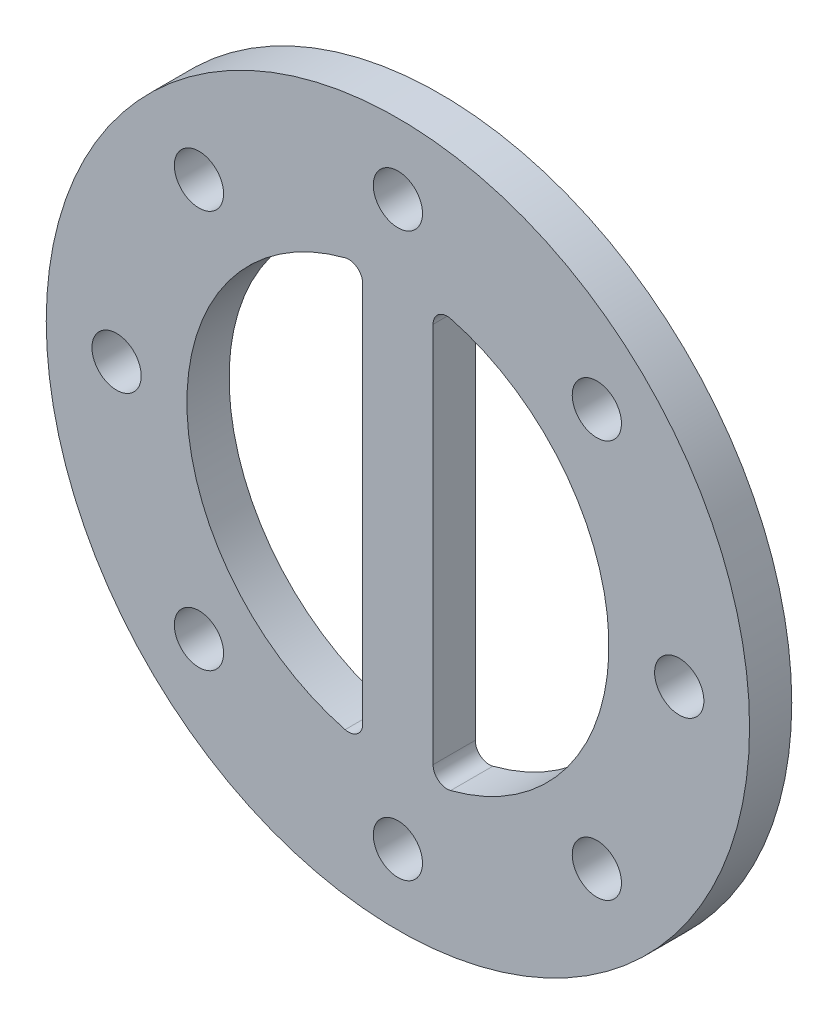
ISO-10303-21;
HEADER;
FILE_DESCRIPTION(('STEP AP214'),'2;1');
FILE_NAME('part.step','',(''),(''),'','','');
FILE_SCHEMA(('AUTOMOTIVE_DESIGN { 1 0 10303 214 1 1 1 1 }'));
ENDSEC;
DATA;
#1=APPLICATION_CONTEXT('core data for automotive mechanical design processes');
#2=APPLICATION_PROTOCOL_DEFINITION('international standard','automotive_design',2000,#1);
#3=PRODUCT_CONTEXT('',#1,'mechanical');
#4=PRODUCT('Part','Part','',(#3));
#5=PRODUCT_RELATED_PRODUCT_CATEGORY('part','',(#4));
#6=PRODUCT_DEFINITION_FORMATION('','',#4);
#7=PRODUCT_DEFINITION_CONTEXT('part definition',#1,'design');
#8=PRODUCT_DEFINITION('design','',#6,#7);
#9=PRODUCT_DEFINITION_SHAPE('','',#8);
#10=(LENGTH_UNIT() NAMED_UNIT(*) SI_UNIT(.MILLI.,.METRE.));
#11=(NAMED_UNIT(*) PLANE_ANGLE_UNIT() SI_UNIT($,.RADIAN.));
#12=(NAMED_UNIT(*) SI_UNIT($,.STERADIAN.) SOLID_ANGLE_UNIT());
#13=UNCERTAINTY_MEASURE_WITH_UNIT(LENGTH_MEASURE(1.E-05),#10,'distance_accuracy_value','');
#14=(GEOMETRIC_REPRESENTATION_CONTEXT(3) GLOBAL_UNCERTAINTY_ASSIGNED_CONTEXT((#13)) GLOBAL_UNIT_ASSIGNED_CONTEXT((#10,
#11,#12)) REPRESENTATION_CONTEXT('',''));
#15=CARTESIAN_POINT('',(0.,0.,0.));
#16=DIRECTION('',(0.,0.,1.));
#17=DIRECTION('',(1.,0.,0.));
#18=AXIS2_PLACEMENT_3D('',#15,#16,#17);
#19=CARTESIAN_POINT('',(0.,0.,3.));
#20=DIRECTION('',(0.,0.,-1.));
#21=DIRECTION('',(-1.,0.,0.));
#22=AXIS2_PLACEMENT_3D('',#19,#20,#21);
#23=CYLINDRICAL_SURFACE('',#22,25.);
#24=CARTESIAN_POINT('',(0.,0.,3.));
#25=DIRECTION('',(0.,0.,1.));
#26=DIRECTION('',(1.,0.,0.));
#27=AXIS2_PLACEMENT_3D('',#24,#25,#26);
#28=CIRCLE('',#27,25.);
#29=CARTESIAN_POINT('',(25.,0.,3.));
#30=VERTEX_POINT('',#29);
#31=EDGE_CURVE('E182',#30,#30,#28,.T.);
#32=ORIENTED_EDGE('',*,*,#31,.F.);
#33=EDGE_LOOP('',(#32));
#34=FACE_BOUND('',#33,.T.);
#35=CARTESIAN_POINT('',(0.,0.,0.));
#36=DIRECTION('',(0.,0.,1.));
#37=DIRECTION('',(1.,0.,0.));
#38=AXIS2_PLACEMENT_3D('',#35,#36,#37);
#39=CIRCLE('',#38,25.);
#40=CARTESIAN_POINT('',(25.,0.,0.));
#41=VERTEX_POINT('',#40);
#42=EDGE_CURVE('E179',#41,#41,#39,.T.);
#43=ORIENTED_EDGE('',*,*,#42,.T.);
#44=EDGE_LOOP('',(#43));
#45=FACE_BOUND('',#44,.T.);
#46=ADVANCED_FACE('F33',(#34,#45),#23,.T.);
#47=CARTESIAN_POINT('',(0.,0.,3.));
#48=DIRECTION('',(0.,0.,1.));
#49=DIRECTION('',(1.,0.,0.));
#50=AXIS2_PLACEMENT_3D('',#47,#48,#49);
#51=PLANE('',#50);
#52=CARTESIAN_POINT('',(0.,0.,3.));
#53=DIRECTION('',(0.,0.,1.));
#54=DIRECTION('',(1.,0.,0.));
#55=AXIS2_PLACEMENT_3D('',#52,#53,#54);
#56=CIRCLE('',#55,15.);
#57=CARTESIAN_POINT('',(3.75,-14.5236875482778,3.));
#58=VERTEX_POINT('',#57);
#59=CARTESIAN_POINT('',(3.75,14.5236875482778,3.));
#60=VERTEX_POINT('',#59);
#61=EDGE_CURVE('E115',#58,#60,#56,.T.);
#62=ORIENTED_EDGE('',*,*,#61,.F.);
#63=CARTESIAN_POINT('',(3.5,-13.555441711726,3.));
#64=DIRECTION('',(0.,0.,1.));
#65=DIRECTION('',(1.,0.,0.));
#66=AXIS2_PLACEMENT_3D('',#63,#64,#65);
#67=CIRCLE('',#66,1.);
#68=CARTESIAN_POINT('',(2.5,-13.555441711726,3.));
#69=VERTEX_POINT('',#68);
#70=EDGE_CURVE('E99',#58,#69,#67,.F.);
#71=ORIENTED_EDGE('',*,*,#70,.T.);
#72=DIRECTION('',(0.,-1.,0.));
#73=VECTOR('',#72,1.);
#74=CARTESIAN_POINT('',(2.5,14.790199457749,3.));
#75=LINE('',#74,#73);
#76=CARTESIAN_POINT('',(2.5,13.555441711726,3.));
#77=VERTEX_POINT('',#76);
#78=EDGE_CURVE('E124',#77,#69,#75,.T.);
#79=ORIENTED_EDGE('',*,*,#78,.F.);
#80=CARTESIAN_POINT('',(3.5,13.555441711726,3.));
#81=DIRECTION('',(0.,0.,1.));
#82=DIRECTION('',(1.,0.,0.));
#83=AXIS2_PLACEMENT_3D('',#80,#81,#82);
#84=CIRCLE('',#83,1.);
#85=EDGE_CURVE('E41',#77,#60,#84,.F.);
#86=ORIENTED_EDGE('',*,*,#85,.T.);
#87=EDGE_LOOP('',(#62,#71,#79,#86));
#88=FACE_BOUND('',#87,.T.);
#89=CARTESIAN_POINT('',(0.,0.,3.));
#90=DIRECTION('',(0.,0.,1.));
#91=DIRECTION('',(1.,0.,0.));
#92=AXIS2_PLACEMENT_3D('',#89,#90,#91);
#93=CIRCLE('',#92,15.);
#94=CARTESIAN_POINT('',(-3.75,14.5236875482778,3.));
#95=VERTEX_POINT('',#94);
#96=CARTESIAN_POINT('',(-3.75,-14.5236875482778,3.));
#97=VERTEX_POINT('',#96);
#98=EDGE_CURVE('E126',#95,#97,#93,.T.);
#99=ORIENTED_EDGE('',*,*,#98,.F.);
#100=CARTESIAN_POINT('',(-3.5,13.555441711726,3.));
#101=DIRECTION('',(0.,0.,1.));
#102=DIRECTION('',(1.,0.,0.));
#103=AXIS2_PLACEMENT_3D('',#100,#101,#102);
#104=CIRCLE('',#103,1.);
#105=CARTESIAN_POINT('',(-2.5,13.555441711726,3.));
#106=VERTEX_POINT('',#105);
#107=EDGE_CURVE('E213',#95,#106,#104,.F.);
#108=ORIENTED_EDGE('',*,*,#107,.T.);
#109=DIRECTION('',(0.,1.,0.));
#110=VECTOR('',#109,1.);
#111=CARTESIAN_POINT('',(-2.5,14.790199457749,3.));
#112=LINE('',#111,#110);
#113=CARTESIAN_POINT('',(-2.5,-13.555441711726,3.));
#114=VERTEX_POINT('',#113);
#115=EDGE_CURVE('E130',#114,#106,#112,.T.);
#116=ORIENTED_EDGE('',*,*,#115,.F.);
#117=CARTESIAN_POINT('',(-3.5,-13.555441711726,3.));
#118=DIRECTION('',(0.,0.,1.));
#119=DIRECTION('',(1.,0.,0.));
#120=AXIS2_PLACEMENT_3D('',#117,#118,#119);
#121=CIRCLE('',#120,1.);
#122=EDGE_CURVE('E209',#114,#97,#121,.F.);
#123=ORIENTED_EDGE('',*,*,#122,.T.);
#124=EDGE_LOOP('',(#99,#108,#116,#123));
#125=FACE_BOUND('',#124,.T.);
#126=CARTESIAN_POINT('',(14.1421356237308,14.1421356237311,3.));
#127=DIRECTION('',(0.,0.,1.));
#128=DIRECTION('',(0.707106781186556,-0.707106781186539,0.));
#129=AXIS2_PLACEMENT_3D('',#126,#127,#128);
#130=CIRCLE('',#129,1.75);
#131=CARTESIAN_POINT('',(15.3795724908073,12.9046987566547,3.));
#132=VERTEX_POINT('',#131);
#133=EDGE_CURVE('E133',#132,#132,#130,.T.);
#134=ORIENTED_EDGE('',*,*,#133,.F.);
#135=EDGE_LOOP('',(#134));
#136=FACE_BOUND('',#135,.T.);
#137=CARTESIAN_POINT('',(20.,2.09418175640307E-13,3.));
#138=DIRECTION('',(0.,0.,1.));
#139=DIRECTION('',(0.,-1.,0.));
#140=AXIS2_PLACEMENT_3D('',#137,#138,#139);
#141=CIRCLE('',#140,1.75);
#142=CARTESIAN_POINT('',(20.,-1.74999999999979,3.));
#143=VERTEX_POINT('',#142);
#144=EDGE_CURVE('E137',#143,#143,#141,.T.);
#145=ORIENTED_EDGE('',*,*,#144,.F.);
#146=EDGE_LOOP('',(#145));
#147=FACE_BOUND('',#146,.T.);
#148=CARTESIAN_POINT('',(14.1421356237311,-14.1421356237308,3.));
#149=DIRECTION('',(0.,0.,1.));
#150=DIRECTION('',(-0.707106781186541,-0.707106781186554,0.));
#151=AXIS2_PLACEMENT_3D('',#148,#149,#150);
#152=CIRCLE('',#151,1.75);
#153=CARTESIAN_POINT('',(12.9046987566546,-15.3795724908073,3.));
#154=VERTEX_POINT('',#153);
#155=EDGE_CURVE('E143',#154,#154,#152,.T.);
#156=ORIENTED_EDGE('',*,*,#155,.F.);
#157=EDGE_LOOP('',(#156));
#158=FACE_BOUND('',#157,.T.);
#159=CARTESIAN_POINT('',(0.,-20.,3.));
#160=DIRECTION('',(0.,0.,1.));
#161=DIRECTION('',(-1.,0.,0.));
#162=AXIS2_PLACEMENT_3D('',#159,#160,#161);
#163=CIRCLE('',#162,1.75);
#164=CARTESIAN_POINT('',(-1.75,-20.,3.));
#165=VERTEX_POINT('',#164);
#166=EDGE_CURVE('E149',#165,#165,#163,.T.);
#167=ORIENTED_EDGE('',*,*,#166,.F.);
#168=EDGE_LOOP('',(#167));
#169=FACE_BOUND('',#168,.T.);
#170=CARTESIAN_POINT('',(-14.1421356237309,-14.142135623731,3.));
#171=DIRECTION('',(0.,0.,1.));
#172=DIRECTION('',(-0.707106781186551,0.707106781186544,0.));
#173=AXIS2_PLACEMENT_3D('',#170,#171,#172);
#174=CIRCLE('',#173,1.75);
#175=CARTESIAN_POINT('',(-15.3795724908073,-12.9046987566546,3.));
#176=VERTEX_POINT('',#175);
#177=EDGE_CURVE('E155',#176,#176,#174,.T.);
#178=ORIENTED_EDGE('',*,*,#177,.F.);
#179=EDGE_LOOP('',(#178));
#180=FACE_BOUND('',#179,.T.);
#181=CARTESIAN_POINT('',(-20.,0.,3.));
#182=DIRECTION('',(0.,0.,1.));
#183=DIRECTION('',(0.,1.,0.));
#184=AXIS2_PLACEMENT_3D('',#181,#182,#183);
#185=CIRCLE('',#184,1.75);
#186=CARTESIAN_POINT('',(-20.,1.74999999999993,3.));
#187=VERTEX_POINT('',#186);
#188=EDGE_CURVE('E161',#187,#187,#185,.T.);
#189=ORIENTED_EDGE('',*,*,#188,.F.);
#190=EDGE_LOOP('',(#189));
#191=FACE_BOUND('',#190,.T.);
#192=CARTESIAN_POINT('',(-14.142135623731,14.1421356237309,3.));
#193=DIRECTION('',(0.,0.,1.));
#194=DIRECTION('',(0.707106781186546,0.707106781186549,0.));
#195=AXIS2_PLACEMENT_3D('',#192,#193,#194);
#196=CIRCLE('',#195,1.75);
#197=CARTESIAN_POINT('',(-12.9046987566545,15.3795724908074,3.));
#198=VERTEX_POINT('',#197);
#199=EDGE_CURVE('E167',#198,#198,#196,.T.);
#200=ORIENTED_EDGE('',*,*,#199,.F.);
#201=EDGE_LOOP('',(#200));
#202=FACE_BOUND('',#201,.T.);
#203=CARTESIAN_POINT('',(0.,20.,3.));
#204=DIRECTION('',(0.,0.,1.));
#205=DIRECTION('',(1.,0.,0.));
#206=AXIS2_PLACEMENT_3D('',#203,#204,#205);
#207=CIRCLE('',#206,1.75);
#208=CARTESIAN_POINT('',(1.75,20.,3.));
#209=VERTEX_POINT('',#208);
#210=EDGE_CURVE('E173',#209,#209,#207,.T.);
#211=ORIENTED_EDGE('',*,*,#210,.F.);
#212=EDGE_LOOP('',(#211));
#213=FACE_BOUND('',#212,.T.);
#214=ORIENTED_EDGE('',*,*,#31,.T.);
#215=EDGE_LOOP('',(#214));
#216=FACE_BOUND('',#215,.T.);
#217=ADVANCED_FACE('F122',(#88,#125,#136,#147,#158,#169,#180,#191,#202,#213,#216),#51,.T.);
#218=CARTESIAN_POINT('',(0.,0.,0.));
#219=DIRECTION('',(0.,0.,1.));
#220=DIRECTION('',(1.,0.,0.));
#221=AXIS2_PLACEMENT_3D('',#218,#219,#220);
#222=PLANE('',#221);
#223=CARTESIAN_POINT('',(0.,0.,0.));
#224=DIRECTION('',(0.,0.,1.));
#225=DIRECTION('',(1.,0.,0.));
#226=AXIS2_PLACEMENT_3D('',#223,#224,#225);
#227=CIRCLE('',#226,15.);
#228=CARTESIAN_POINT('',(3.75,-14.5236875482778,0.));
#229=VERTEX_POINT('',#228);
#230=CARTESIAN_POINT('',(3.75,14.5236875482778,0.));
#231=VERTEX_POINT('',#230);
#232=EDGE_CURVE('E118',#229,#231,#227,.T.);
#233=ORIENTED_EDGE('',*,*,#232,.T.);
#234=CARTESIAN_POINT('',(3.5,13.555441711726,0.));
#235=DIRECTION('',(0.,0.,1.));
#236=DIRECTION('',(1.,0.,0.));
#237=AXIS2_PLACEMENT_3D('',#234,#235,#236);
#238=CIRCLE('',#237,1.);
#239=CARTESIAN_POINT('',(2.5,13.555441711726,0.));
#240=VERTEX_POINT('',#239);
#241=EDGE_CURVE('E11',#231,#240,#238,.T.);
#242=ORIENTED_EDGE('',*,*,#241,.T.);
#243=DIRECTION('',(0.,-1.,0.));
#244=VECTOR('',#243,1.);
#245=CARTESIAN_POINT('',(2.5,0.,0.));
#246=LINE('',#245,#244);
#247=CARTESIAN_POINT('',(2.5,-13.555441711726,0.));
#248=VERTEX_POINT('',#247);
#249=EDGE_CURVE('E191',#240,#248,#246,.T.);
#250=ORIENTED_EDGE('',*,*,#249,.T.);
#251=CARTESIAN_POINT('',(3.5,-13.555441711726,0.));
#252=DIRECTION('',(0.,0.,1.));
#253=DIRECTION('',(1.,0.,0.));
#254=AXIS2_PLACEMENT_3D('',#251,#252,#253);
#255=CIRCLE('',#254,1.);
#256=EDGE_CURVE('E109',#248,#229,#255,.T.);
#257=ORIENTED_EDGE('',*,*,#256,.T.);
#258=EDGE_LOOP('',(#233,#242,#250,#257));
#259=FACE_BOUND('',#258,.T.);
#260=CARTESIAN_POINT('',(0.,0.,0.));
#261=DIRECTION('',(0.,0.,1.));
#262=DIRECTION('',(1.,0.,0.));
#263=AXIS2_PLACEMENT_3D('',#260,#261,#262);
#264=CIRCLE('',#263,15.);
#265=CARTESIAN_POINT('',(-3.75,14.5236875482778,0.));
#266=VERTEX_POINT('',#265);
#267=CARTESIAN_POINT('',(-3.75,-14.5236875482778,0.));
#268=VERTEX_POINT('',#267);
#269=EDGE_CURVE('E189',#266,#268,#264,.T.);
#270=ORIENTED_EDGE('',*,*,#269,.T.);
#271=CARTESIAN_POINT('',(-3.5,-13.555441711726,0.));
#272=DIRECTION('',(0.,0.,1.));
#273=DIRECTION('',(1.,0.,0.));
#274=AXIS2_PLACEMENT_3D('',#271,#272,#273);
#275=CIRCLE('',#274,1.);
#276=CARTESIAN_POINT('',(-2.5,-13.555441711726,0.));
#277=VERTEX_POINT('',#276);
#278=EDGE_CURVE('E211',#268,#277,#275,.T.);
#279=ORIENTED_EDGE('',*,*,#278,.T.);
#280=DIRECTION('',(0.,1.,0.));
#281=VECTOR('',#280,1.);
#282=CARTESIAN_POINT('',(-2.5,0.,0.));
#283=LINE('',#282,#281);
#284=CARTESIAN_POINT('',(-2.5,13.555441711726,0.));
#285=VERTEX_POINT('',#284);
#286=EDGE_CURVE('E185',#277,#285,#283,.T.);
#287=ORIENTED_EDGE('',*,*,#286,.T.);
#288=CARTESIAN_POINT('',(-3.5,13.555441711726,0.));
#289=DIRECTION('',(0.,0.,1.));
#290=DIRECTION('',(1.,0.,0.));
#291=AXIS2_PLACEMENT_3D('',#288,#289,#290);
#292=CIRCLE('',#291,1.);
#293=EDGE_CURVE('E55',#285,#266,#292,.T.);
#294=ORIENTED_EDGE('',*,*,#293,.T.);
#295=EDGE_LOOP('',(#270,#279,#287,#294));
#296=FACE_BOUND('',#295,.T.);
#297=CARTESIAN_POINT('',(14.1421356237308,14.1421356237311,0.));
#298=DIRECTION('',(0.,0.,1.));
#299=DIRECTION('',(0.707106781186556,-0.707106781186539,0.));
#300=AXIS2_PLACEMENT_3D('',#297,#298,#299);
#301=CIRCLE('',#300,1.75);
#302=CARTESIAN_POINT('',(15.3795724908073,12.9046987566547,0.));
#303=VERTEX_POINT('',#302);
#304=EDGE_CURVE('E134',#303,#303,#301,.T.);
#305=ORIENTED_EDGE('',*,*,#304,.T.);
#306=EDGE_LOOP('',(#305));
#307=FACE_BOUND('',#306,.T.);
#308=CARTESIAN_POINT('',(20.,2.09418175640307E-13,0.));
#309=DIRECTION('',(0.,0.,1.));
#310=DIRECTION('',(0.,-1.,0.));
#311=AXIS2_PLACEMENT_3D('',#308,#309,#310);
#312=CIRCLE('',#311,1.75);
#313=CARTESIAN_POINT('',(20.,-1.74999999999979,0.));
#314=VERTEX_POINT('',#313);
#315=EDGE_CURVE('E140',#314,#314,#312,.T.);
#316=ORIENTED_EDGE('',*,*,#315,.T.);
#317=EDGE_LOOP('',(#316));
#318=FACE_BOUND('',#317,.T.);
#319=CARTESIAN_POINT('',(14.1421356237311,-14.1421356237308,0.));
#320=DIRECTION('',(0.,0.,1.));
#321=DIRECTION('',(-0.707106781186541,-0.707106781186554,0.));
#322=AXIS2_PLACEMENT_3D('',#319,#320,#321);
#323=CIRCLE('',#322,1.75);
#324=CARTESIAN_POINT('',(12.9046987566546,-15.3795724908073,0.));
#325=VERTEX_POINT('',#324);
#326=EDGE_CURVE('E146',#325,#325,#323,.T.);
#327=ORIENTED_EDGE('',*,*,#326,.T.);
#328=EDGE_LOOP('',(#327));
#329=FACE_BOUND('',#328,.T.);
#330=CARTESIAN_POINT('',(0.,-20.,0.));
#331=DIRECTION('',(0.,0.,1.));
#332=DIRECTION('',(-1.,0.,0.));
#333=AXIS2_PLACEMENT_3D('',#330,#331,#332);
#334=CIRCLE('',#333,1.75);
#335=CARTESIAN_POINT('',(-1.75,-20.,0.));
#336=VERTEX_POINT('',#335);
#337=EDGE_CURVE('E152',#336,#336,#334,.T.);
#338=ORIENTED_EDGE('',*,*,#337,.T.);
#339=EDGE_LOOP('',(#338));
#340=FACE_BOUND('',#339,.T.);
#341=CARTESIAN_POINT('',(-14.1421356237309,-14.142135623731,0.));
#342=DIRECTION('',(0.,0.,1.));
#343=DIRECTION('',(-0.707106781186551,0.707106781186544,0.));
#344=AXIS2_PLACEMENT_3D('',#341,#342,#343);
#345=CIRCLE('',#344,1.75);
#346=CARTESIAN_POINT('',(-15.3795724908073,-12.9046987566546,0.));
#347=VERTEX_POINT('',#346);
#348=EDGE_CURVE('E158',#347,#347,#345,.T.);
#349=ORIENTED_EDGE('',*,*,#348,.T.);
#350=EDGE_LOOP('',(#349));
#351=FACE_BOUND('',#350,.T.);
#352=CARTESIAN_POINT('',(-20.,0.,0.));
#353=DIRECTION('',(0.,0.,1.));
#354=DIRECTION('',(0.,1.,0.));
#355=AXIS2_PLACEMENT_3D('',#352,#353,#354);
#356=CIRCLE('',#355,1.75);
#357=CARTESIAN_POINT('',(-20.,1.74999999999993,0.));
#358=VERTEX_POINT('',#357);
#359=EDGE_CURVE('E164',#358,#358,#356,.T.);
#360=ORIENTED_EDGE('',*,*,#359,.T.);
#361=EDGE_LOOP('',(#360));
#362=FACE_BOUND('',#361,.T.);
#363=CARTESIAN_POINT('',(-14.142135623731,14.1421356237309,0.));
#364=DIRECTION('',(0.,0.,1.));
#365=DIRECTION('',(0.707106781186546,0.707106781186549,0.));
#366=AXIS2_PLACEMENT_3D('',#363,#364,#365);
#367=CIRCLE('',#366,1.75);
#368=CARTESIAN_POINT('',(-12.9046987566545,15.3795724908074,0.));
#369=VERTEX_POINT('',#368);
#370=EDGE_CURVE('E170',#369,#369,#367,.T.);
#371=ORIENTED_EDGE('',*,*,#370,.T.);
#372=EDGE_LOOP('',(#371));
#373=FACE_BOUND('',#372,.T.);
#374=CARTESIAN_POINT('',(0.,20.,0.));
#375=DIRECTION('',(0.,0.,1.));
#376=DIRECTION('',(1.,0.,0.));
#377=AXIS2_PLACEMENT_3D('',#374,#375,#376);
#378=CIRCLE('',#377,1.75);
#379=CARTESIAN_POINT('',(1.75,20.,0.));
#380=VERTEX_POINT('',#379);
#381=EDGE_CURVE('E176',#380,#380,#378,.T.);
#382=ORIENTED_EDGE('',*,*,#381,.T.);
#383=EDGE_LOOP('',(#382));
#384=FACE_BOUND('',#383,.T.);
#385=ORIENTED_EDGE('',*,*,#42,.F.);
#386=EDGE_LOOP('',(#385));
#387=FACE_BOUND('',#386,.T.);
#388=ADVANCED_FACE('F228',(#259,#296,#307,#318,#329,#340,#351,#362,#373,#384,#387),#222,.F.);
#389=CARTESIAN_POINT('',(0.,20.,0.));
#390=DIRECTION('',(0.,0.,1.));
#391=DIRECTION('',(1.,0.,0.));
#392=AXIS2_PLACEMENT_3D('',#389,#390,#391);
#393=CYLINDRICAL_SURFACE('',#392,1.75);
#394=ORIENTED_EDGE('',*,*,#381,.F.);
#395=EDGE_LOOP('',(#394));
#396=FACE_BOUND('',#395,.T.);
#397=ORIENTED_EDGE('',*,*,#210,.T.);
#398=EDGE_LOOP('',(#397));
#399=FACE_BOUND('',#398,.T.);
#400=ADVANCED_FACE('F251',(#396,#399),#393,.F.);
#401=CARTESIAN_POINT('',(-14.142135623731,14.1421356237309,0.));
#402=DIRECTION('',(0.,0.,1.));
#403=DIRECTION('',(1.,0.,0.));
#404=AXIS2_PLACEMENT_3D('',#401,#402,#403);
#405=CYLINDRICAL_SURFACE('',#404,1.75);
#406=ORIENTED_EDGE('',*,*,#370,.F.);
#407=EDGE_LOOP('',(#406));
#408=FACE_BOUND('',#407,.T.);
#409=ORIENTED_EDGE('',*,*,#199,.T.);
#410=EDGE_LOOP('',(#409));
#411=FACE_BOUND('',#410,.T.);
#412=ADVANCED_FACE('F256',(#408,#411),#405,.F.);
#413=CARTESIAN_POINT('',(-20.,0.,0.));
#414=DIRECTION('',(0.,0.,1.));
#415=DIRECTION('',(1.,0.,0.));
#416=AXIS2_PLACEMENT_3D('',#413,#414,#415);
#417=CYLINDRICAL_SURFACE('',#416,1.75);
#418=ORIENTED_EDGE('',*,*,#359,.F.);
#419=EDGE_LOOP('',(#418));
#420=FACE_BOUND('',#419,.T.);
#421=ORIENTED_EDGE('',*,*,#188,.T.);
#422=EDGE_LOOP('',(#421));
#423=FACE_BOUND('',#422,.T.);
#424=ADVANCED_FACE('F260',(#420,#423),#417,.F.);
#425=CARTESIAN_POINT('',(-14.1421356237309,-14.142135623731,0.));
#426=DIRECTION('',(0.,0.,1.));
#427=DIRECTION('',(1.,0.,0.));
#428=AXIS2_PLACEMENT_3D('',#425,#426,#427);
#429=CYLINDRICAL_SURFACE('',#428,1.75);
#430=ORIENTED_EDGE('',*,*,#348,.F.);
#431=EDGE_LOOP('',(#430));
#432=FACE_BOUND('',#431,.T.);
#433=ORIENTED_EDGE('',*,*,#177,.T.);
#434=EDGE_LOOP('',(#433));
#435=FACE_BOUND('',#434,.T.);
#436=ADVANCED_FACE('F264',(#432,#435),#429,.F.);
#437=CARTESIAN_POINT('',(0.,-20.,0.));
#438=DIRECTION('',(0.,0.,1.));
#439=DIRECTION('',(1.,0.,0.));
#440=AXIS2_PLACEMENT_3D('',#437,#438,#439);
#441=CYLINDRICAL_SURFACE('',#440,1.75);
#442=ORIENTED_EDGE('',*,*,#337,.F.);
#443=EDGE_LOOP('',(#442));
#444=FACE_BOUND('',#443,.T.);
#445=ORIENTED_EDGE('',*,*,#166,.T.);
#446=EDGE_LOOP('',(#445));
#447=FACE_BOUND('',#446,.T.);
#448=ADVANCED_FACE('F268',(#444,#447),#441,.F.);
#449=CARTESIAN_POINT('',(14.1421356237311,-14.1421356237308,0.));
#450=DIRECTION('',(0.,0.,1.));
#451=DIRECTION('',(1.,0.,0.));
#452=AXIS2_PLACEMENT_3D('',#449,#450,#451);
#453=CYLINDRICAL_SURFACE('',#452,1.75);
#454=ORIENTED_EDGE('',*,*,#326,.F.);
#455=EDGE_LOOP('',(#454));
#456=FACE_BOUND('',#455,.T.);
#457=ORIENTED_EDGE('',*,*,#155,.T.);
#458=EDGE_LOOP('',(#457));
#459=FACE_BOUND('',#458,.T.);
#460=ADVANCED_FACE('F272',(#456,#459),#453,.F.);
#461=CARTESIAN_POINT('',(20.,2.09418175640307E-13,0.));
#462=DIRECTION('',(0.,0.,1.));
#463=DIRECTION('',(1.,0.,0.));
#464=AXIS2_PLACEMENT_3D('',#461,#462,#463);
#465=CYLINDRICAL_SURFACE('',#464,1.75);
#466=ORIENTED_EDGE('',*,*,#315,.F.);
#467=EDGE_LOOP('',(#466));
#468=FACE_BOUND('',#467,.T.);
#469=ORIENTED_EDGE('',*,*,#144,.T.);
#470=EDGE_LOOP('',(#469));
#471=FACE_BOUND('',#470,.T.);
#472=ADVANCED_FACE('F276',(#468,#471),#465,.F.);
#473=CARTESIAN_POINT('',(14.1421356237308,14.1421356237311,0.));
#474=DIRECTION('',(0.,0.,1.));
#475=DIRECTION('',(1.,0.,0.));
#476=AXIS2_PLACEMENT_3D('',#473,#474,#475);
#477=CYLINDRICAL_SURFACE('',#476,1.75);
#478=ORIENTED_EDGE('',*,*,#304,.F.);
#479=EDGE_LOOP('',(#478));
#480=FACE_BOUND('',#479,.T.);
#481=ORIENTED_EDGE('',*,*,#133,.T.);
#482=EDGE_LOOP('',(#481));
#483=FACE_BOUND('',#482,.T.);
#484=ADVANCED_FACE('F280',(#480,#483),#477,.F.);
#485=CARTESIAN_POINT('',(0.,0.,-7.));
#486=DIRECTION('',(0.,0.,1.));
#487=DIRECTION('',(1.,0.,0.));
#488=AXIS2_PLACEMENT_3D('',#485,#486,#487);
#489=CYLINDRICAL_SURFACE('',#488,15.);
#490=ORIENTED_EDGE('',*,*,#98,.T.);
#491=DIRECTION('',(0.,0.,1.));
#492=VECTOR('',#491,1.);
#493=CARTESIAN_POINT('',(-3.75,-14.5236875482778,-7.));
#494=LINE('',#493,#492);
#495=EDGE_CURVE('E48',#97,#268,#494,.F.);
#496=ORIENTED_EDGE('',*,*,#495,.T.);
#497=ORIENTED_EDGE('',*,*,#269,.F.);
#498=DIRECTION('',(0.,0.,1.));
#499=VECTOR('',#498,1.);
#500=CARTESIAN_POINT('',(-3.75,14.5236875482778,-7.));
#501=LINE('',#500,#499);
#502=EDGE_CURVE('E204',#266,#95,#501,.T.);
#503=ORIENTED_EDGE('',*,*,#502,.T.);
#504=EDGE_LOOP('',(#490,#496,#497,#503));
#505=FACE_BOUND('',#504,.T.);
#506=ADVANCED_FACE('F226',(#505),#489,.F.);
#507=CARTESIAN_POINT('',(-2.5,14.790199457749,-7.));
#508=DIRECTION('',(1.,0.,0.));
#509=DIRECTION('',(0.,0.,-1.));
#510=AXIS2_PLACEMENT_3D('',#507,#508,#509);
#511=PLANE('',#510);
#512=ORIENTED_EDGE('',*,*,#286,.F.);
#513=DIRECTION('',(0.,0.,-1.));
#514=VECTOR('',#513,1.);
#515=CARTESIAN_POINT('',(-2.5,-13.555441711726,3.));
#516=LINE('',#515,#514);
#517=EDGE_CURVE('E201',#277,#114,#516,.F.);
#518=ORIENTED_EDGE('',*,*,#517,.T.);
#519=ORIENTED_EDGE('',*,*,#115,.T.);
#520=DIRECTION('',(0.,0.,-1.));
#521=VECTOR('',#520,1.);
#522=CARTESIAN_POINT('',(-2.5,13.555441711726,0.));
#523=LINE('',#522,#521);
#524=EDGE_CURVE('E199',#106,#285,#523,.T.);
#525=ORIENTED_EDGE('',*,*,#524,.T.);
#526=EDGE_LOOP('',(#512,#518,#519,#525));
#527=FACE_BOUND('',#526,.T.);
#528=ADVANCED_FACE('F223',(#527),#511,.F.);
#529=CARTESIAN_POINT('',(0.,0.,-7.));
#530=DIRECTION('',(0.,0.,1.));
#531=DIRECTION('',(1.,0.,0.));
#532=AXIS2_PLACEMENT_3D('',#529,#530,#531);
#533=CYLINDRICAL_SURFACE('',#532,15.);
#534=ORIENTED_EDGE('',*,*,#232,.F.);
#535=DIRECTION('',(0.,0.,1.));
#536=VECTOR('',#535,1.);
#537=CARTESIAN_POINT('',(3.75,-14.5236875482778,-7.));
#538=LINE('',#537,#536);
#539=EDGE_CURVE('E103',#229,#58,#538,.T.);
#540=ORIENTED_EDGE('',*,*,#539,.T.);
#541=ORIENTED_EDGE('',*,*,#61,.T.);
#542=DIRECTION('',(0.,0.,1.));
#543=VECTOR('',#542,1.);
#544=CARTESIAN_POINT('',(3.75,14.5236875482778,-7.));
#545=LINE('',#544,#543);
#546=EDGE_CURVE('E120',#60,#231,#545,.F.);
#547=ORIENTED_EDGE('',*,*,#546,.T.);
#548=EDGE_LOOP('',(#534,#540,#541,#547));
#549=FACE_BOUND('',#548,.T.);
#550=ADVANCED_FACE('F114',(#549),#533,.F.);
#551=CARTESIAN_POINT('',(2.5,14.790199457749,-7.));
#552=DIRECTION('',(-1.,0.,0.));
#553=DIRECTION('',(0.,0.,1.));
#554=AXIS2_PLACEMENT_3D('',#551,#552,#553);
#555=PLANE('',#554);
#556=ORIENTED_EDGE('',*,*,#78,.T.);
#557=DIRECTION('',(0.,0.,-1.));
#558=VECTOR('',#557,1.);
#559=CARTESIAN_POINT('',(2.5,-13.555441711726,0.));
#560=LINE('',#559,#558);
#561=EDGE_CURVE('E104',#69,#248,#560,.T.);
#562=ORIENTED_EDGE('',*,*,#561,.T.);
#563=ORIENTED_EDGE('',*,*,#249,.F.);
#564=DIRECTION('',(0.,0.,-1.));
#565=VECTOR('',#564,1.);
#566=CARTESIAN_POINT('',(2.5,13.555441711726,3.));
#567=LINE('',#566,#565);
#568=EDGE_CURVE('E119',#240,#77,#567,.F.);
#569=ORIENTED_EDGE('',*,*,#568,.T.);
#570=EDGE_LOOP('',(#556,#562,#563,#569));
#571=FACE_BOUND('',#570,.T.);
#572=ADVANCED_FACE('F238',(#571),#555,.F.);
#573=CARTESIAN_POINT('',(3.5,-13.555441711726,-7.));
#574=DIRECTION('',(0.,0.,1.));
#575=DIRECTION('',(1.,0.,0.));
#576=AXIS2_PLACEMENT_3D('',#573,#574,#575);
#577=CYLINDRICAL_SURFACE('',#576,1.);
#578=ORIENTED_EDGE('',*,*,#256,.F.);
#579=ORIENTED_EDGE('',*,*,#561,.F.);
#580=ORIENTED_EDGE('',*,*,#70,.F.);
#581=ORIENTED_EDGE('',*,*,#539,.F.);
#582=EDGE_LOOP('',(#578,#579,#580,#581));
#583=FACE_BOUND('',#582,.T.);
#584=ADVANCED_FACE('F102',(#583),#577,.F.);
#585=CARTESIAN_POINT('',(-3.5,-13.555441711726,-7.));
#586=DIRECTION('',(0.,0.,1.));
#587=DIRECTION('',(1.,0.,0.));
#588=AXIS2_PLACEMENT_3D('',#585,#586,#587);
#589=CYLINDRICAL_SURFACE('',#588,1.);
#590=ORIENTED_EDGE('',*,*,#278,.F.);
#591=ORIENTED_EDGE('',*,*,#495,.F.);
#592=ORIENTED_EDGE('',*,*,#122,.F.);
#593=ORIENTED_EDGE('',*,*,#517,.F.);
#594=EDGE_LOOP('',(#590,#591,#592,#593));
#595=FACE_BOUND('',#594,.T.);
#596=ADVANCED_FACE('F231',(#595),#589,.F.);
#597=CARTESIAN_POINT('',(-3.5,13.555441711726,-7.));
#598=DIRECTION('',(0.,0.,1.));
#599=DIRECTION('',(1.,0.,0.));
#600=AXIS2_PLACEMENT_3D('',#597,#598,#599);
#601=CYLINDRICAL_SURFACE('',#600,1.);
#602=ORIENTED_EDGE('',*,*,#293,.F.);
#603=ORIENTED_EDGE('',*,*,#524,.F.);
#604=ORIENTED_EDGE('',*,*,#107,.F.);
#605=ORIENTED_EDGE('',*,*,#502,.F.);
#606=EDGE_LOOP('',(#602,#603,#604,#605));
#607=FACE_BOUND('',#606,.T.);
#608=ADVANCED_FACE('F225',(#607),#601,.F.);
#609=CARTESIAN_POINT('',(3.5,13.555441711726,-7.));
#610=DIRECTION('',(0.,0.,1.));
#611=DIRECTION('',(1.,0.,0.));
#612=AXIS2_PLACEMENT_3D('',#609,#610,#611);
#613=CYLINDRICAL_SURFACE('',#612,1.);
#614=ORIENTED_EDGE('',*,*,#241,.F.);
#615=ORIENTED_EDGE('',*,*,#546,.F.);
#616=ORIENTED_EDGE('',*,*,#85,.F.);
#617=ORIENTED_EDGE('',*,*,#568,.F.);
#618=EDGE_LOOP('',(#614,#615,#616,#617));
#619=FACE_BOUND('',#618,.T.);
#620=ADVANCED_FACE('F35',(#619),#613,.F.);
#621=CLOSED_SHELL('',(#46,#217,#388,#400,#412,#424,#436,#448,#460,#472,#484,#506,#528,#550,#572,
#584,#596,#608,#620));
#622=MANIFOLD_SOLID_BREP('B2',#621);
#623=ADVANCED_BREP_SHAPE_REPRESENTATION('',(#18,#622),#14);
#624=SHAPE_DEFINITION_REPRESENTATION(#9,#623);
ENDSEC;
END-ISO-10303-21;
